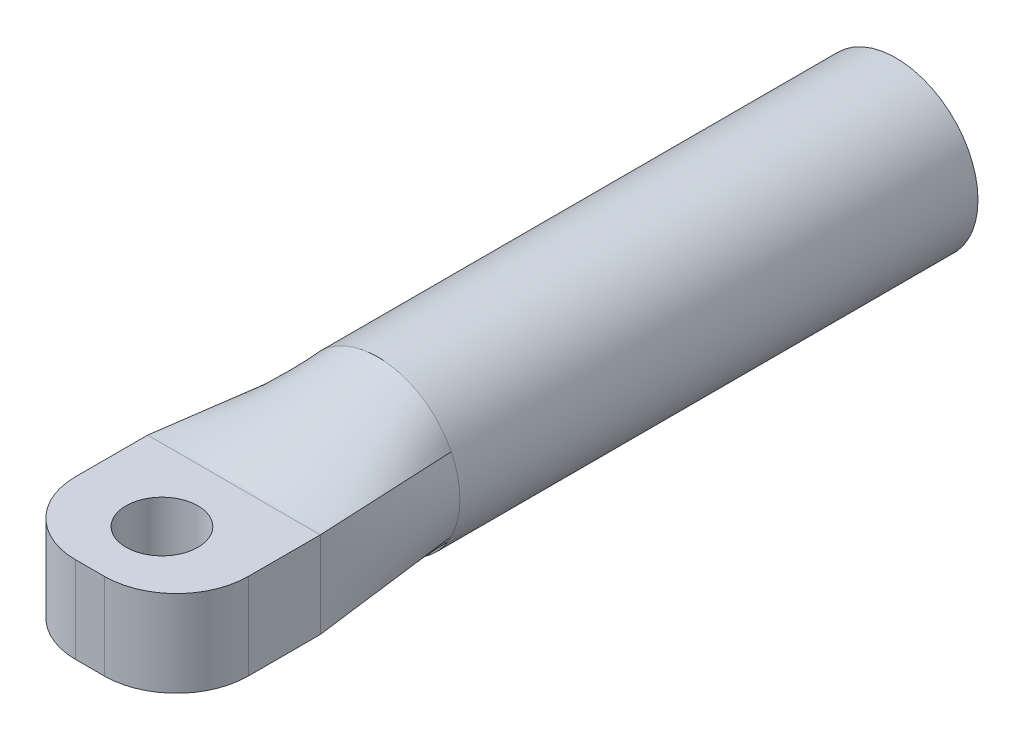
ISO-10303-21;
HEADER;
FILE_DESCRIPTION(('STEP AP214'),'2;1');
FILE_NAME('part.step','',(''),(''),'','','');
FILE_SCHEMA(('AUTOMOTIVE_DESIGN { 1 0 10303 214 1 1 1 1 }'));
ENDSEC;
DATA;
#1=APPLICATION_CONTEXT('core data for automotive mechanical design processes');
#2=APPLICATION_PROTOCOL_DEFINITION('international standard','automotive_design',2000,#1);
#3=PRODUCT_CONTEXT('',#1,'mechanical');
#4=PRODUCT('Part','Part','',(#3));
#5=PRODUCT_RELATED_PRODUCT_CATEGORY('part','',(#4));
#6=PRODUCT_DEFINITION_FORMATION('','',#4);
#7=PRODUCT_DEFINITION_CONTEXT('part definition',#1,'design');
#8=PRODUCT_DEFINITION('design','',#6,#7);
#9=PRODUCT_DEFINITION_SHAPE('','',#8);
#10=(LENGTH_UNIT() NAMED_UNIT(*) SI_UNIT(.MILLI.,.METRE.));
#11=(NAMED_UNIT(*) PLANE_ANGLE_UNIT() SI_UNIT($,.RADIAN.));
#12=(NAMED_UNIT(*) SI_UNIT($,.STERADIAN.) SOLID_ANGLE_UNIT());
#13=UNCERTAINTY_MEASURE_WITH_UNIT(LENGTH_MEASURE(1.E-05),#10,'distance_accuracy_value','');
#14=(GEOMETRIC_REPRESENTATION_CONTEXT(3) GLOBAL_UNCERTAINTY_ASSIGNED_CONTEXT((#13)) GLOBAL_UNIT_ASSIGNED_CONTEXT((#10,
#11,#12)) REPRESENTATION_CONTEXT('',''));
#15=CARTESIAN_POINT('',(0.,0.,0.));
#16=DIRECTION('',(0.,0.,1.));
#17=DIRECTION('',(1.,0.,0.));
#18=AXIS2_PLACEMENT_3D('',#15,#16,#17);
#19=CARTESIAN_POINT('',(-2.54911749434976,-1.27455874717488,18.));
#20=CARTESIAN_POINT('',(-3.,-1.5,23.));
#21=CARTESIAN_POINT('',(-2.45411749434976,-1.46455874717488,18.));
#22=CARTESIAN_POINT('',(-2.75,-1.5,23.));
#23=CARTESIAN_POINT('',(-2.33099495944295,-1.65751492245293,18.));
#24=CARTESIAN_POINT('',(-2.5,-1.5,23.));
#25=CARTESIAN_POINT('',(-2.01864904774124,-2.02631420099548,18.));
#26=CARTESIAN_POINT('',(-2.,-1.5,23.));
#27=CARTESIAN_POINT('',(-1.82911872991313,-2.20196188832214,18.));
#28=CARTESIAN_POINT('',(-1.75,-1.5,23.));
#29=CARTESIAN_POINT('',(-1.38660108793129,-2.50432603881563,18.));
#30=CARTESIAN_POINT('',(-1.25,-1.5,23.));
#31=CARTESIAN_POINT('',(-1.13351460231023,-2.63056148769304,18.));
#32=CARTESIAN_POINT('',(-1.,-1.5,23.));
#33=CARTESIAN_POINT('',(-0.586813096309174,-2.80363326492329,18.));
#34=CARTESIAN_POINT('',(-0.500000000000001,-1.5,23.));
#35=CARTESIAN_POINT('',(-0.293566144656201,-2.85,18.));
#36=CARTESIAN_POINT('',(-0.250000000000002,-1.5,23.));
#37=CARTESIAN_POINT('',(0.293566144656199,-2.85,18.));
#38=CARTESIAN_POINT('',(0.249999999999998,-1.5,23.));
#39=CARTESIAN_POINT('',(0.586813096309172,-2.80363326492329,18.));
#40=CARTESIAN_POINT('',(0.499999999999999,-1.5,23.));
#41=CARTESIAN_POINT('',(1.13351460231023,-2.63056148769304,18.));
#42=CARTESIAN_POINT('',(0.999999999999999,-1.5,23.));
#43=CARTESIAN_POINT('',(1.38660108793129,-2.50432603881563,18.));
#44=CARTESIAN_POINT('',(1.25,-1.5,23.));
#45=CARTESIAN_POINT('',(1.82911872991313,-2.20196188832214,18.));
#46=CARTESIAN_POINT('',(1.75,-1.5,23.));
#47=CARTESIAN_POINT('',(2.01864904774124,-2.02631420099549,18.));
#48=CARTESIAN_POINT('',(2.,-1.5,23.));
#49=CARTESIAN_POINT('',(2.33099495944295,-1.65751492245293,18.));
#50=CARTESIAN_POINT('',(2.5,-1.5,23.));
#51=CARTESIAN_POINT('',(2.45411749434976,-1.46455874717488,18.));
#52=CARTESIAN_POINT('',(2.75,-1.5,23.));
#53=CARTESIAN_POINT('',(2.54911749434976,-1.27455874717488,18.));
#54=CARTESIAN_POINT('',(3.,-1.5,23.));
#55=B_SPLINE_SURFACE_WITH_KNOTS('',3,1,((#19,#20),(#21,#22),(#23,#24),(#25,#26),(#27,#28),(#29,
#30),(#31,#32),(#33,#34),(#35,#36),(#37,#38),(#39,#40),(#41,#42),(#43,#44),(#45,#46),(#47,#48),
(#49,#50),(#51,#52),(#53,#54)),.UNSPECIFIED.,.F.,.F.,.F.,(4,2,2,2,2,2,2,2,4),(2,2),(0.,0.125,
0.25,0.375,0.5,0.625,0.75,0.875,1.),(0.,1.),.UNSPECIFIED.);
#56=CARTESIAN_POINT('',(2.42331241114719,-1.50000000007966,18.));
#57=CARTESIAN_POINT('',(2.46511015905567,-1.50000000002213,18.7438909579106));
#58=CARTESIAN_POINT('',(2.50690790693315,-1.50000000000458,19.4877819158229));
#59=CARTESIAN_POINT('',(2.57447434392676,-1.49999999999718,20.6902883692278));
#60=CARTESIAN_POINT('',(2.6002430330545,-1.49999999999929,21.1489038647199));
#61=CARTESIAN_POINT('',(2.65178041130152,-1.50000000000071,22.0661348557044));
#62=CARTESIAN_POINT('',(2.6775491004208,-1.50000000000003,22.5247503511969));
#63=CARTESIAN_POINT('',(2.70362933618601,-1.5,22.9889105644587));
#64=CARTESIAN_POINT('',(2.70394088280845,-1.5,22.9944552822294));
#65=CARTESIAN_POINT('',(2.70425242943089,-1.5,23.));
#66=B_SPLINE_CURVE_WITH_KNOTS('',3,(#56,#57,#58,#59,#60,#61,#62,#63,#64,#65),.UNSPECIFIED.,.F.,
.F.,(4,2,2,2,4),(0.,2.23519289568524,3.61320950748747,4.99122611928969,5.00788650968383),.UNSPECIFIED.);
#67=CARTESIAN_POINT('',(2.42331828717886,-1.5,18.));
#68=VERTEX_POINT('',#67);
#69=CARTESIAN_POINT('',(2.70425242943088,-1.5,23.));
#70=VERTEX_POINT('',#69);
#71=EDGE_CURVE('E156',#68,#70,#66,.T.);
#72=CARTESIAN_POINT('',(0.,0.,18.));
#73=DIRECTION('',(0.,0.,1.));
#74=DIRECTION('',(1.,0.,0.));
#75=AXIS2_PLACEMENT_3D('',#72,#73,#74);
#76=CIRCLE('',#75,2.85);
#77=CARTESIAN_POINT('',(2.54919151146212,-1.27459536041392,18.));
#78=VERTEX_POINT('',#77);
#79=EDGE_CURVE('E246',#68,#78,#76,.T.);
#80=DIRECTION('',(-0.0897216548856422,0.0448608274428209,-0.994956044660128));
#81=VECTOR('',#80,1.);
#82=CARTESIAN_POINT('',(2.77455874717488,-1.38727937358744,20.5));
#83=LINE('',#82,#81);
#84=CARTESIAN_POINT('',(3.,-1.5,23.));
#85=VERTEX_POINT('',#84);
#86=EDGE_CURVE('E346',#85,#78,#83,.T.);
#87=DIRECTION('',(1.,0.,0.));
#88=VECTOR('',#87,1.);
#89=CARTESIAN_POINT('',(-3.,-1.5,23.));
#90=LINE('',#89,#88);
#91=EDGE_CURVE('E163',#70,#85,#90,.T.);
#92=ORIENTED_EDGE('',*,*,#71,.F.);
#93=ORIENTED_EDGE('',*,*,#79,.T.);
#94=ORIENTED_EDGE('',*,*,#86,.F.);
#95=ORIENTED_EDGE('',*,*,#91,.F.);
#96=EDGE_LOOP('',(#92,#93,#94,#95));
#97=FACE_BOUND('',#96,.T.);
#98=ADVANCED_FACE('F65',(#97),#55,.T.);
#99=CARTESIAN_POINT('',(0.,0.,18.));
#100=DIRECTION('',(0.,0.,-1.));
#101=DIRECTION('',(-1.,0.,0.));
#102=AXIS2_PLACEMENT_3D('',#99,#100,#101);
#103=CYLINDRICAL_SURFACE('',#102,2.85);
#104=CARTESIAN_POINT('',(2.54911749434976,1.27455874717488,18.));
#105=CARTESIAN_POINT('',(2.45411749434976,1.46455874717488,18.));
#106=CARTESIAN_POINT('',(2.33099495944295,1.65751492245293,18.));
#107=CARTESIAN_POINT('',(2.01864904774124,2.02631420099548,18.));
#108=CARTESIAN_POINT('',(1.82911872991313,2.20196188832214,18.));
#109=CARTESIAN_POINT('',(1.38660108793129,2.50432603881563,18.));
#110=CARTESIAN_POINT('',(1.13351460231023,2.63056148769304,18.));
#111=CARTESIAN_POINT('',(0.586813096309173,2.80363326492329,18.));
#112=CARTESIAN_POINT('',(0.2935661446562,2.85,18.));
#113=CARTESIAN_POINT('',(-0.2935661446562,2.85,18.));
#114=CARTESIAN_POINT('',(-0.586813096309173,2.80363326492329,18.));
#115=CARTESIAN_POINT('',(-1.13351460231023,2.63056148769304,18.));
#116=CARTESIAN_POINT('',(-1.38660108793129,2.50432603881563,18.));
#117=CARTESIAN_POINT('',(-1.82911872991313,2.20196188832214,18.));
#118=CARTESIAN_POINT('',(-2.01864904774124,2.02631420099549,18.));
#119=CARTESIAN_POINT('',(-2.33099495944295,1.65751492245293,18.));
#120=CARTESIAN_POINT('',(-2.45411749434976,1.46455874717488,18.));
#121=CARTESIAN_POINT('',(-2.54911749434976,1.27455874717488,18.));
#122=B_SPLINE_CURVE_WITH_KNOTS('',3,(#104,#105,#106,#107,#108,#109,#110,#111,#112,#113,#114,
#115,#116,#117,#118,#119,#120,#121),.UNSPECIFIED.,.F.,.F.,(4,2,2,2,2,2,2,2,4),(0.,0.125,0.25,
0.375,0.5,0.625,0.75,0.875,1.),.UNSPECIFIED.);
#123=CARTESIAN_POINT('',(2.54921024222569,1.2746046100769,18.));
#124=VERTEX_POINT('',#123);
#125=CARTESIAN_POINT('',(-2.54919151146212,1.27459536041392,18.));
#126=VERTEX_POINT('',#125);
#127=EDGE_CURVE('E252',#124,#126,#122,.T.);
#128=ORIENTED_EDGE('',*,*,#127,.F.);
#129=EDGE_CURVE('E242',#78,#124,#76,.T.);
#130=ORIENTED_EDGE('',*,*,#129,.F.);
#131=ORIENTED_EDGE('',*,*,#79,.F.);
#132=CARTESIAN_POINT('',(0.,-2.85,18.));
#133=VERTEX_POINT('',#132);
#134=EDGE_CURVE('E245',#133,#68,#76,.T.);
#135=ORIENTED_EDGE('',*,*,#134,.F.);
#136=CARTESIAN_POINT('',(-2.42331828717886,-1.5,18.));
#137=VERTEX_POINT('',#136);
#138=EDGE_CURVE('E227',#137,#133,#76,.T.);
#139=ORIENTED_EDGE('',*,*,#138,.F.);
#140=CARTESIAN_POINT('',(-2.54921024222569,-1.2746046100769,18.));
#141=VERTEX_POINT('',#140);
#142=EDGE_CURVE('E152',#141,#137,#76,.T.);
#143=ORIENTED_EDGE('',*,*,#142,.F.);
#144=EDGE_CURVE('E226',#126,#141,#76,.T.);
#145=ORIENTED_EDGE('',*,*,#144,.F.);
#146=EDGE_LOOP('',(#128,#130,#131,#135,#139,#143,#145));
#147=FACE_BOUND('',#146,.T.);
#148=CARTESIAN_POINT('',(0.,0.,0.));
#149=DIRECTION('',(0.,0.,1.));
#150=DIRECTION('',(1.,0.,0.));
#151=AXIS2_PLACEMENT_3D('',#148,#149,#150);
#152=CIRCLE('',#151,2.85);
#153=CARTESIAN_POINT('',(2.85,0.,0.));
#154=VERTEX_POINT('',#153);
#155=EDGE_CURVE('E218',#154,#154,#152,.T.);
#156=ORIENTED_EDGE('',*,*,#155,.T.);
#157=EDGE_LOOP('',(#156));
#158=FACE_BOUND('',#157,.T.);
#159=ADVANCED_FACE('F391',(#147,#158),#103,.T.);
#160=CARTESIAN_POINT('',(0.,0.,0.));
#161=DIRECTION('',(0.,0.,1.));
#162=DIRECTION('',(1.,0.,0.));
#163=AXIS2_PLACEMENT_3D('',#160,#161,#162);
#164=PLANE('',#163);
#165=CARTESIAN_POINT('',(0.,0.,0.));
#166=DIRECTION('',(0.,0.,-1.));
#167=DIRECTION('',(-1.,0.,0.));
#168=AXIS2_PLACEMENT_3D('',#165,#166,#167);
#169=CIRCLE('',#168,1.65);
#170=CARTESIAN_POINT('',(-1.65,0.,0.));
#171=VERTEX_POINT('',#170);
#172=EDGE_CURVE('E673',#171,#171,#169,.T.);
#173=ORIENTED_EDGE('',*,*,#172,.F.);
#174=EDGE_LOOP('',(#173));
#175=FACE_BOUND('',#174,.T.);
#176=ORIENTED_EDGE('',*,*,#155,.F.);
#177=EDGE_LOOP('',(#176));
#178=FACE_BOUND('',#177,.T.);
#179=ADVANCED_FACE('F291',(#175,#178),#164,.F.);
#180=CARTESIAN_POINT('',(2.54911749434976,-1.27455874717488,18.));
#181=CARTESIAN_POINT('',(3.,-1.5,23.));
#182=CARTESIAN_POINT('',(2.64411749434976,-1.08455874717488,18.));
#183=CARTESIAN_POINT('',(3.,-1.25,23.));
#184=CARTESIAN_POINT('',(2.72018186532636,-0.878653835003161,18.));
#185=CARTESIAN_POINT('',(3.,-1.,23.));
#186=CARTESIAN_POINT('',(2.82317542788669,-0.448444473254999,18.));
#187=CARTESIAN_POINT('',(3.,-0.5,23.));
#188=CARTESIAN_POINT('',(2.85,-0.224264578624801,18.));
#189=CARTESIAN_POINT('',(3.,-0.25,23.));
#190=CARTESIAN_POINT('',(2.85,0.2242645786248,18.));
#191=CARTESIAN_POINT('',(3.,0.25,23.));
#192=CARTESIAN_POINT('',(2.82317542788669,0.448444473254998,18.));
#193=CARTESIAN_POINT('',(3.,0.5,23.));
#194=CARTESIAN_POINT('',(2.72018186532636,0.87865383500316,18.));
#195=CARTESIAN_POINT('',(3.,1.,23.));
#196=CARTESIAN_POINT('',(2.64411749434976,1.08455874717488,18.));
#197=CARTESIAN_POINT('',(3.,1.25,23.));
#198=CARTESIAN_POINT('',(2.54911749434976,1.27455874717488,18.));
#199=CARTESIAN_POINT('',(3.,1.5,23.));
#200=B_SPLINE_SURFACE_WITH_KNOTS('',3,1,((#180,#181),(#182,#183),(#184,#185),(#186,#187),(#188,
#189),(#190,#191),(#192,#193),(#194,#195),(#196,#197),(#198,#199)),.UNSPECIFIED.,.F.,.F.,.F.,(4,
2,2,2,4),(2,2),(0.,0.25,0.5,0.75,1.),(0.,1.),.UNSPECIFIED.);
#201=DIRECTION('',(0.0897216548856421,0.044860827442821,0.994956044660128));
#202=VECTOR('',#201,1.);
#203=CARTESIAN_POINT('',(2.77455874717488,1.38727937358744,20.5));
#204=LINE('',#203,#202);
#205=CARTESIAN_POINT('',(3.,1.5,23.));
#206=VERTEX_POINT('',#205);
#207=EDGE_CURVE('E337',#124,#206,#204,.T.);
#208=DIRECTION('',(0.,1.,0.));
#209=VECTOR('',#208,1.);
#210=CARTESIAN_POINT('',(3.,-1.5,23.));
#211=LINE('',#210,#209);
#212=EDGE_CURVE('E269',#85,#206,#211,.T.);
#213=ORIENTED_EDGE('',*,*,#129,.T.);
#214=ORIENTED_EDGE('',*,*,#207,.T.);
#215=ORIENTED_EDGE('',*,*,#212,.F.);
#216=ORIENTED_EDGE('',*,*,#86,.T.);
#217=EDGE_LOOP('',(#213,#214,#215,#216));
#218=FACE_BOUND('',#217,.T.);
#219=ADVANCED_FACE('F284',(#218),#200,.T.);
#220=CARTESIAN_POINT('',(2.54911749434976,1.27455874717488,18.));
#221=CARTESIAN_POINT('',(3.,1.5,23.));
#222=CARTESIAN_POINT('',(2.45411749434976,1.46455874717488,18.));
#223=CARTESIAN_POINT('',(2.75,1.5,23.));
#224=CARTESIAN_POINT('',(2.33099495944295,1.65751492245293,18.));
#225=CARTESIAN_POINT('',(2.5,1.5,23.));
#226=CARTESIAN_POINT('',(2.01864904774124,2.02631420099548,18.));
#227=CARTESIAN_POINT('',(2.,1.5,23.));
#228=CARTESIAN_POINT('',(1.82911872991313,2.20196188832214,18.));
#229=CARTESIAN_POINT('',(1.75,1.5,23.));
#230=CARTESIAN_POINT('',(1.38660108793129,2.50432603881563,18.));
#231=CARTESIAN_POINT('',(1.25,1.5,23.));
#232=CARTESIAN_POINT('',(1.13351460231023,2.63056148769304,18.));
#233=CARTESIAN_POINT('',(1.,1.5,23.));
#234=CARTESIAN_POINT('',(0.586813096309173,2.80363326492329,18.));
#235=CARTESIAN_POINT('',(0.500000000000001,1.5,23.));
#236=CARTESIAN_POINT('',(0.2935661446562,2.85,18.));
#237=CARTESIAN_POINT('',(0.250000000000001,1.5,23.));
#238=CARTESIAN_POINT('',(-0.2935661446562,2.85,18.));
#239=CARTESIAN_POINT('',(-0.249999999999999,1.5,23.));
#240=CARTESIAN_POINT('',(-0.586813096309173,2.80363326492329,18.));
#241=CARTESIAN_POINT('',(-0.499999999999999,1.5,23.));
#242=CARTESIAN_POINT('',(-1.13351460231023,2.63056148769304,18.));
#243=CARTESIAN_POINT('',(-0.999999999999999,1.5,23.));
#244=CARTESIAN_POINT('',(-1.38660108793129,2.50432603881563,18.));
#245=CARTESIAN_POINT('',(-1.25,1.5,23.));
#246=CARTESIAN_POINT('',(-1.82911872991313,2.20196188832214,18.));
#247=CARTESIAN_POINT('',(-1.75,1.5,23.));
#248=CARTESIAN_POINT('',(-2.01864904774124,2.02631420099549,18.));
#249=CARTESIAN_POINT('',(-2.,1.5,23.));
#250=CARTESIAN_POINT('',(-2.33099495944295,1.65751492245293,18.));
#251=CARTESIAN_POINT('',(-2.5,1.5,23.));
#252=CARTESIAN_POINT('',(-2.45411749434976,1.46455874717488,18.));
#253=CARTESIAN_POINT('',(-2.75,1.5,23.));
#254=CARTESIAN_POINT('',(-2.54911749434976,1.27455874717488,18.));
#255=CARTESIAN_POINT('',(-3.,1.5,23.));
#256=B_SPLINE_SURFACE_WITH_KNOTS('',3,1,((#220,#221),(#222,#223),(#224,#225),(#226,#227),(#228,
#229),(#230,#231),(#232,#233),(#234,#235),(#236,#237),(#238,#239),(#240,#241),(#242,#243),(#244,
#245),(#246,#247),(#248,#249),(#250,#251),(#252,#253),(#254,#255)),.UNSPECIFIED.,.F.,.F.,.F.,(4,
2,2,2,2,2,2,2,4),(2,2),(0.,0.125,0.25,0.375,0.5,0.625,0.75,0.875,1.),(0.,1.),.UNSPECIFIED.);
#257=DIRECTION('',(-0.0897216548856419,0.0448608274428211,0.994956044660128));
#258=VECTOR('',#257,1.);
#259=CARTESIAN_POINT('',(-2.77455874717488,1.38727937358744,20.5));
#260=LINE('',#259,#258);
#261=CARTESIAN_POINT('',(-3.,1.5,23.));
#262=VERTEX_POINT('',#261);
#263=EDGE_CURVE('E334',#126,#262,#260,.T.);
#264=DIRECTION('',(-1.,0.,0.));
#265=VECTOR('',#264,1.);
#266=CARTESIAN_POINT('',(-3.,1.5,23.));
#267=LINE('',#266,#265);
#268=EDGE_CURVE('E208',#206,#262,#267,.T.);
#269=ORIENTED_EDGE('',*,*,#127,.T.);
#270=ORIENTED_EDGE('',*,*,#263,.T.);
#271=ORIENTED_EDGE('',*,*,#268,.F.);
#272=ORIENTED_EDGE('',*,*,#207,.F.);
#273=EDGE_LOOP('',(#269,#270,#271,#272));
#274=FACE_BOUND('',#273,.T.);
#275=ADVANCED_FACE('F290',(#274),#256,.T.);
#276=CARTESIAN_POINT('',(-2.42331241114719,-1.50000000007966,18.));
#277=CARTESIAN_POINT('',(-2.46511015905379,-1.50000000002214,18.7438909579107));
#278=CARTESIAN_POINT('',(-2.50690790693243,-1.50000000000458,19.4877819158229));
#279=CARTESIAN_POINT('',(-2.5744743439272,-1.49999999999718,20.6902883692278));
#280=CARTESIAN_POINT('',(-2.60024303305521,-1.49999999999928,21.1489038647198));
#281=CARTESIAN_POINT('',(-2.6517804113008,-1.50000000000072,22.0661348557045));
#282=CARTESIAN_POINT('',(-2.67754910041838,-1.50000000000005,22.5247503511971));
#283=CARTESIAN_POINT('',(-2.70362933618595,-1.5,22.9889105644587));
#284=CARTESIAN_POINT('',(-2.70394088280842,-1.5,22.9944552822294));
#285=CARTESIAN_POINT('',(-2.70425242943089,-1.5,23.));
#286=B_SPLINE_CURVE_WITH_KNOTS('',3,(#276,#277,#278,#279,#280,#281,#282,#283,#284,#285),
.UNSPECIFIED.,.F.,.F.,(4,2,2,2,4),(0.,2.23519289568522,3.61320950748746,4.99122611928969,
5.00788650968382),.UNSPECIFIED.);
#287=CARTESIAN_POINT('',(-2.70425242943089,-1.5,23.));
#288=VERTEX_POINT('',#287);
#289=EDGE_CURVE('E145',#288,#137,#286,.F.);
#290=CARTESIAN_POINT('',(-3.,-1.5,23.));
#291=VERTEX_POINT('',#290);
#292=EDGE_CURVE('E149',#291,#288,#90,.T.);
#293=DIRECTION('',(-0.089721654885642,-0.0448608274428211,0.994956044660128));
#294=VECTOR('',#293,1.);
#295=CARTESIAN_POINT('',(-2.77455874717488,-1.38727937358744,20.5));
#296=LINE('',#295,#294);
#297=EDGE_CURVE('E343',#141,#291,#296,.T.);
#298=ORIENTED_EDGE('',*,*,#289,.F.);
#299=ORIENTED_EDGE('',*,*,#292,.F.);
#300=ORIENTED_EDGE('',*,*,#297,.F.);
#301=ORIENTED_EDGE('',*,*,#142,.T.);
#302=EDGE_LOOP('',(#298,#299,#300,#301));
#303=FACE_BOUND('',#302,.T.);
#304=ADVANCED_FACE('F147',(#303),#55,.T.);
#305=CARTESIAN_POINT('',(-2.54911749434976,1.27455874717488,18.));
#306=CARTESIAN_POINT('',(-3.,1.5,23.));
#307=CARTESIAN_POINT('',(-2.64411749434976,1.08455874717488,18.));
#308=CARTESIAN_POINT('',(-3.,1.25,23.));
#309=CARTESIAN_POINT('',(-2.72018186532636,0.87865383500316,18.));
#310=CARTESIAN_POINT('',(-3.,1.,23.));
#311=CARTESIAN_POINT('',(-2.82317542788669,0.448444473254999,18.));
#312=CARTESIAN_POINT('',(-3.,0.500000000000001,23.));
#313=CARTESIAN_POINT('',(-2.85,0.224264578624801,18.));
#314=CARTESIAN_POINT('',(-3.,0.250000000000001,23.));
#315=CARTESIAN_POINT('',(-2.85,-0.2242645786248,18.));
#316=CARTESIAN_POINT('',(-3.,-0.249999999999999,23.));
#317=CARTESIAN_POINT('',(-2.82317542788669,-0.448444473254998,18.));
#318=CARTESIAN_POINT('',(-3.,-0.499999999999999,23.));
#319=CARTESIAN_POINT('',(-2.72018186532636,-0.87865383500316,18.));
#320=CARTESIAN_POINT('',(-3.,-0.999999999999999,23.));
#321=CARTESIAN_POINT('',(-2.64411749434976,-1.08455874717488,18.));
#322=CARTESIAN_POINT('',(-3.,-1.25,23.));
#323=CARTESIAN_POINT('',(-2.54911749434976,-1.27455874717488,18.));
#324=CARTESIAN_POINT('',(-3.,-1.5,23.));
#325=B_SPLINE_SURFACE_WITH_KNOTS('',3,1,((#305,#306),(#307,#308),(#309,#310),(#311,#312),(#313,
#314),(#315,#316),(#317,#318),(#319,#320),(#321,#322),(#323,#324)),.UNSPECIFIED.,.F.,.F.,.F.,(4,
2,2,2,4),(2,2),(0.,0.25,0.5,0.75,1.),(0.,1.),.UNSPECIFIED.);
#326=DIRECTION('',(0.,-1.,0.));
#327=VECTOR('',#326,1.);
#328=CARTESIAN_POINT('',(-3.,-1.5,23.));
#329=LINE('',#328,#327);
#330=EDGE_CURVE('E162',#262,#291,#329,.T.);
#331=ORIENTED_EDGE('',*,*,#144,.T.);
#332=ORIENTED_EDGE('',*,*,#297,.T.);
#333=ORIENTED_EDGE('',*,*,#330,.F.);
#334=ORIENTED_EDGE('',*,*,#263,.F.);
#335=EDGE_LOOP('',(#331,#332,#333,#334));
#336=FACE_BOUND('',#335,.T.);
#337=ADVANCED_FACE('F283',(#336),#325,.T.);
#338=CARTESIAN_POINT('',(3.,-1.5,28.));
#339=DIRECTION('',(-1.,0.,0.));
#340=DIRECTION('',(0.,0.,1.));
#341=AXIS2_PLACEMENT_3D('',#338,#339,#340);
#342=PLANE('',#341);
#343=DIRECTION('',(0.,0.,-1.));
#344=VECTOR('',#343,1.);
#345=CARTESIAN_POINT('',(3.,1.5,28.));
#346=LINE('',#345,#344);
#347=CARTESIAN_POINT('',(3.,1.5,25.5));
#348=VERTEX_POINT('',#347);
#349=EDGE_CURVE('E258',#348,#206,#346,.T.);
#350=ORIENTED_EDGE('',*,*,#349,.F.);
#351=DIRECTION('',(0.,1.,0.));
#352=VECTOR('',#351,1.);
#353=CARTESIAN_POINT('',(3.,-1.5,25.5));
#354=LINE('',#353,#352);
#355=CARTESIAN_POINT('',(3.,-1.5,25.5));
#356=VERTEX_POINT('',#355);
#357=EDGE_CURVE('E88',#348,#356,#354,.F.);
#358=ORIENTED_EDGE('',*,*,#357,.T.);
#359=DIRECTION('',(0.,0.,-1.));
#360=VECTOR('',#359,1.);
#361=CARTESIAN_POINT('',(3.,-1.5,28.));
#362=LINE('',#361,#360);
#363=EDGE_CURVE('E445',#356,#85,#362,.T.);
#364=ORIENTED_EDGE('',*,*,#363,.T.);
#365=ORIENTED_EDGE('',*,*,#212,.T.);
#366=EDGE_LOOP('',(#350,#358,#364,#365));
#367=FACE_BOUND('',#366,.T.);
#368=ADVANCED_FACE('F274',(#367),#342,.F.);
#369=CARTESIAN_POINT('',(-3.,1.5,28.));
#370=DIRECTION('',(0.,-1.,0.));
#371=DIRECTION('',(0.,0.,-1.));
#372=AXIS2_PLACEMENT_3D('',#369,#370,#371);
#373=PLANE('',#372);
#374=CARTESIAN_POINT('',(0.,1.5,25.5));
#375=DIRECTION('',(0.,1.,0.));
#376=DIRECTION('',(0.,0.,1.));
#377=AXIS2_PLACEMENT_3D('',#374,#375,#376);
#378=CIRCLE('',#377,1.25);
#379=CARTESIAN_POINT('',(0.,1.5,26.75));
#380=VERTEX_POINT('',#379);
#381=EDGE_CURVE('E669',#380,#380,#378,.T.);
#382=ORIENTED_EDGE('',*,*,#381,.F.);
#383=EDGE_LOOP('',(#382));
#384=FACE_BOUND('',#383,.T.);
#385=DIRECTION('',(-1.,0.,0.));
#386=VECTOR('',#385,1.);
#387=CARTESIAN_POINT('',(-3.,1.5,28.));
#388=LINE('',#387,#386);
#389=CARTESIAN_POINT('',(0.5,1.5,28.));
#390=VERTEX_POINT('',#389);
#391=CARTESIAN_POINT('',(-0.5,1.5,28.));
#392=VERTEX_POINT('',#391);
#393=EDGE_CURVE('E447',#390,#392,#388,.T.);
#394=ORIENTED_EDGE('',*,*,#393,.F.);
#395=CARTESIAN_POINT('',(0.5,1.5,25.5));
#396=DIRECTION('',(0.,-1.,0.));
#397=DIRECTION('',(0.,0.,-1.));
#398=AXIS2_PLACEMENT_3D('',#395,#396,#397);
#399=CIRCLE('',#398,2.5);
#400=EDGE_CURVE('E493',#390,#348,#399,.F.);
#401=ORIENTED_EDGE('',*,*,#400,.T.);
#402=ORIENTED_EDGE('',*,*,#349,.T.);
#403=ORIENTED_EDGE('',*,*,#268,.T.);
#404=DIRECTION('',(0.,0.,-1.));
#405=VECTOR('',#404,1.);
#406=CARTESIAN_POINT('',(-3.,1.5,28.));
#407=LINE('',#406,#405);
#408=CARTESIAN_POINT('',(-3.,1.5,25.5));
#409=VERTEX_POINT('',#408);
#410=EDGE_CURVE('E256',#409,#262,#407,.T.);
#411=ORIENTED_EDGE('',*,*,#410,.F.);
#412=CARTESIAN_POINT('',(-0.5,1.5,25.5));
#413=DIRECTION('',(0.,-1.,0.));
#414=DIRECTION('',(0.,0.,-1.));
#415=AXIS2_PLACEMENT_3D('',#412,#413,#414);
#416=CIRCLE('',#415,2.5);
#417=EDGE_CURVE('E255',#409,#392,#416,.F.);
#418=ORIENTED_EDGE('',*,*,#417,.T.);
#419=EDGE_LOOP('',(#394,#401,#402,#403,#411,#418));
#420=FACE_BOUND('',#419,.T.);
#421=ADVANCED_FACE('F192',(#384,#420),#373,.F.);
#422=CARTESIAN_POINT('',(-3.,-1.5,28.));
#423=DIRECTION('',(1.,0.,0.));
#424=DIRECTION('',(0.,0.,-1.));
#425=AXIS2_PLACEMENT_3D('',#422,#423,#424);
#426=PLANE('',#425);
#427=DIRECTION('',(0.,0.,-1.));
#428=VECTOR('',#427,1.);
#429=CARTESIAN_POINT('',(-3.,-1.5,28.));
#430=LINE('',#429,#428);
#431=CARTESIAN_POINT('',(-3.,-1.5,25.5));
#432=VERTEX_POINT('',#431);
#433=EDGE_CURVE('E161',#432,#291,#430,.T.);
#434=ORIENTED_EDGE('',*,*,#433,.F.);
#435=DIRECTION('',(0.,-1.,0.));
#436=VECTOR('',#435,1.);
#437=CARTESIAN_POINT('',(-3.,-1.5,25.5));
#438=LINE('',#437,#436);
#439=EDGE_CURVE('E12',#432,#409,#438,.F.);
#440=ORIENTED_EDGE('',*,*,#439,.T.);
#441=ORIENTED_EDGE('',*,*,#410,.T.);
#442=ORIENTED_EDGE('',*,*,#330,.T.);
#443=EDGE_LOOP('',(#434,#440,#441,#442));
#444=FACE_BOUND('',#443,.T.);
#445=ADVANCED_FACE('F186',(#444),#426,.F.);
#446=CARTESIAN_POINT('',(-3.,-1.5,28.));
#447=DIRECTION('',(0.,1.,0.));
#448=DIRECTION('',(0.,0.,1.));
#449=AXIS2_PLACEMENT_3D('',#446,#447,#448);
#450=PLANE('',#449);
#451=CARTESIAN_POINT('',(0.,-1.5,25.5));
#452=DIRECTION('',(0.,1.,0.));
#453=DIRECTION('',(0.,0.,1.));
#454=AXIS2_PLACEMENT_3D('',#451,#452,#453);
#455=CIRCLE('',#454,1.25);
#456=CARTESIAN_POINT('',(0.,-1.5,26.75));
#457=VERTEX_POINT('',#456);
#458=EDGE_CURVE('E672',#457,#457,#455,.F.);
#459=ORIENTED_EDGE('',*,*,#458,.F.);
#460=EDGE_LOOP('',(#459));
#461=FACE_BOUND('',#460,.T.);
#462=ORIENTED_EDGE('',*,*,#363,.F.);
#463=CARTESIAN_POINT('',(0.5,-1.5,25.5));
#464=DIRECTION('',(0.,1.,0.));
#465=DIRECTION('',(0.,0.,1.));
#466=AXIS2_PLACEMENT_3D('',#463,#464,#465);
#467=CIRCLE('',#466,2.5);
#468=CARTESIAN_POINT('',(0.5,-1.5,28.));
#469=VERTEX_POINT('',#468);
#470=EDGE_CURVE('E73',#356,#469,#467,.F.);
#471=ORIENTED_EDGE('',*,*,#470,.T.);
#472=DIRECTION('',(1.,0.,0.));
#473=VECTOR('',#472,1.);
#474=CARTESIAN_POINT('',(-3.,-1.5,28.));
#475=LINE('',#474,#473);
#476=CARTESIAN_POINT('',(-0.5,-1.5,28.));
#477=VERTEX_POINT('',#476);
#478=EDGE_CURVE('E232',#477,#469,#475,.T.);
#479=ORIENTED_EDGE('',*,*,#478,.F.);
#480=CARTESIAN_POINT('',(-0.5,-1.5,25.5));
#481=DIRECTION('',(0.,1.,0.));
#482=DIRECTION('',(0.,0.,1.));
#483=AXIS2_PLACEMENT_3D('',#480,#481,#482);
#484=CIRCLE('',#483,2.5);
#485=EDGE_CURVE('E80',#477,#432,#484,.F.);
#486=ORIENTED_EDGE('',*,*,#485,.T.);
#487=ORIENTED_EDGE('',*,*,#433,.T.);
#488=ORIENTED_EDGE('',*,*,#292,.T.);
#489=ORIENTED_EDGE('',*,*,#289,.T.);
#490=DIRECTION('',(-1.,0.,0.));
#491=VECTOR('',#490,1.);
#492=CARTESIAN_POINT('',(3.00237388059694,-1.5,18.));
#493=LINE('',#492,#491);
#494=EDGE_CURVE('E157',#68,#137,#493,.T.);
#495=ORIENTED_EDGE('',*,*,#494,.F.);
#496=ORIENTED_EDGE('',*,*,#71,.T.);
#497=ORIENTED_EDGE('',*,*,#91,.T.);
#498=EDGE_LOOP('',(#462,#471,#479,#486,#487,#488,#489,#495,#496,#497));
#499=FACE_BOUND('',#498,.T.);
#500=ADVANCED_FACE('F160',(#461,#499),#450,.F.);
#501=CARTESIAN_POINT('',(0.,0.,28.));
#502=DIRECTION('',(0.,0.,-1.));
#503=DIRECTION('',(-1.,0.,0.));
#504=AXIS2_PLACEMENT_3D('',#501,#502,#503);
#505=PLANE('',#504);
#506=ORIENTED_EDGE('',*,*,#478,.T.);
#507=DIRECTION('',(0.,1.,0.));
#508=VECTOR('',#507,1.);
#509=CARTESIAN_POINT('',(0.5,0.,28.));
#510=LINE('',#509,#508);
#511=EDGE_CURVE('E251',#469,#390,#510,.T.);
#512=ORIENTED_EDGE('',*,*,#511,.T.);
#513=ORIENTED_EDGE('',*,*,#393,.T.);
#514=DIRECTION('',(0.,-1.,0.));
#515=VECTOR('',#514,1.);
#516=CARTESIAN_POINT('',(-0.5,0.,28.));
#517=LINE('',#516,#515);
#518=EDGE_CURVE('E248',#392,#477,#517,.T.);
#519=ORIENTED_EDGE('',*,*,#518,.T.);
#520=EDGE_LOOP('',(#506,#512,#513,#519));
#521=FACE_BOUND('',#520,.T.);
#522=ADVANCED_FACE('F185',(#521),#505,.F.);
#523=CARTESIAN_POINT('',(3.00237388059694,-1.5,18.));
#524=DIRECTION('',(0.,0.,-1.));
#525=DIRECTION('',(-1.,0.,0.));
#526=AXIS2_PLACEMENT_3D('',#523,#524,#525);
#527=PLANE('',#526);
#528=ORIENTED_EDGE('',*,*,#138,.T.);
#529=ORIENTED_EDGE('',*,*,#134,.T.);
#530=ORIENTED_EDGE('',*,*,#494,.T.);
#531=EDGE_LOOP('',(#528,#529,#530));
#532=FACE_BOUND('',#531,.T.);
#533=ADVANCED_FACE('F466',(#532),#527,.F.);
#534=CARTESIAN_POINT('',(0.,0.,15.));
#535=DIRECTION('',(0.,0.,-1.));
#536=DIRECTION('',(-1.,0.,0.));
#537=AXIS2_PLACEMENT_3D('',#534,#535,#536);
#538=CYLINDRICAL_SURFACE('',#537,1.65);
#539=CARTESIAN_POINT('',(0.,0.,15.));
#540=DIRECTION('',(0.,0.,-1.));
#541=DIRECTION('',(-1.,0.,0.));
#542=AXIS2_PLACEMENT_3D('',#539,#540,#541);
#543=CIRCLE('',#542,1.65);
#544=CARTESIAN_POINT('',(-1.65,0.,15.));
#545=VERTEX_POINT('',#544);
#546=EDGE_CURVE('E676',#545,#545,#543,.T.);
#547=ORIENTED_EDGE('',*,*,#546,.F.);
#548=EDGE_LOOP('',(#547));
#549=FACE_BOUND('',#548,.T.);
#550=ORIENTED_EDGE('',*,*,#172,.T.);
#551=EDGE_LOOP('',(#550));
#552=FACE_BOUND('',#551,.T.);
#553=ADVANCED_FACE('F471',(#549,#552),#538,.F.);
#554=CARTESIAN_POINT('',(0.,0.,15.));
#555=DIRECTION('',(0.,0.,-1.));
#556=DIRECTION('',(-1.,0.,0.));
#557=AXIS2_PLACEMENT_3D('',#554,#555,#556);
#558=PLANE('',#557);
#559=ORIENTED_EDGE('',*,*,#546,.T.);
#560=EDGE_LOOP('',(#559));
#561=FACE_BOUND('',#560,.T.);
#562=ADVANCED_FACE('F503',(#561),#558,.T.);
#563=CARTESIAN_POINT('',(0.5,0.,25.5));
#564=DIRECTION('',(0.,1.,0.));
#565=DIRECTION('',(0.,0.,1.));
#566=AXIS2_PLACEMENT_3D('',#563,#564,#565);
#567=CYLINDRICAL_SURFACE('',#566,2.5);
#568=ORIENTED_EDGE('',*,*,#470,.F.);
#569=ORIENTED_EDGE('',*,*,#357,.F.);
#570=ORIENTED_EDGE('',*,*,#400,.F.);
#571=ORIENTED_EDGE('',*,*,#511,.F.);
#572=EDGE_LOOP('',(#568,#569,#570,#571));
#573=FACE_BOUND('',#572,.T.);
#574=ADVANCED_FACE('F395',(#573),#567,.T.);
#575=CARTESIAN_POINT('',(-0.5,0.,25.5));
#576=DIRECTION('',(0.,-1.,0.));
#577=DIRECTION('',(0.,0.,-1.));
#578=AXIS2_PLACEMENT_3D('',#575,#576,#577);
#579=CYLINDRICAL_SURFACE('',#578,2.5);
#580=ORIENTED_EDGE('',*,*,#417,.F.);
#581=ORIENTED_EDGE('',*,*,#439,.F.);
#582=ORIENTED_EDGE('',*,*,#485,.F.);
#583=ORIENTED_EDGE('',*,*,#518,.F.);
#584=EDGE_LOOP('',(#580,#581,#582,#583));
#585=FACE_BOUND('',#584,.T.);
#586=ADVANCED_FACE('F67',(#585),#579,.T.);
#587=CARTESIAN_POINT('',(0.,-2.86100000003099,25.5));
#588=DIRECTION('',(0.,1.,0.));
#589=DIRECTION('',(0.,0.,1.));
#590=AXIS2_PLACEMENT_3D('',#587,#588,#589);
#591=CYLINDRICAL_SURFACE('',#590,1.25);
#592=ORIENTED_EDGE('',*,*,#381,.T.);
#593=EDGE_LOOP('',(#592));
#594=FACE_BOUND('',#593,.T.);
#595=ORIENTED_EDGE('',*,*,#458,.T.);
#596=EDGE_LOOP('',(#595));
#597=FACE_BOUND('',#596,.T.);
#598=ADVANCED_FACE('F508',(#594,#597),#591,.F.);
#599=CLOSED_SHELL('',(#98,#159,#179,#219,#275,#304,#337,#368,#421,#445,#500,#522,#533,#553,#562,
#574,#586,#598));
#600=MANIFOLD_SOLID_BREP('B2',#599);
#601=ADVANCED_BREP_SHAPE_REPRESENTATION('',(#18,#600),#14);
#602=SHAPE_DEFINITION_REPRESENTATION(#9,#601);
ENDSEC;
END-ISO-10303-21;
